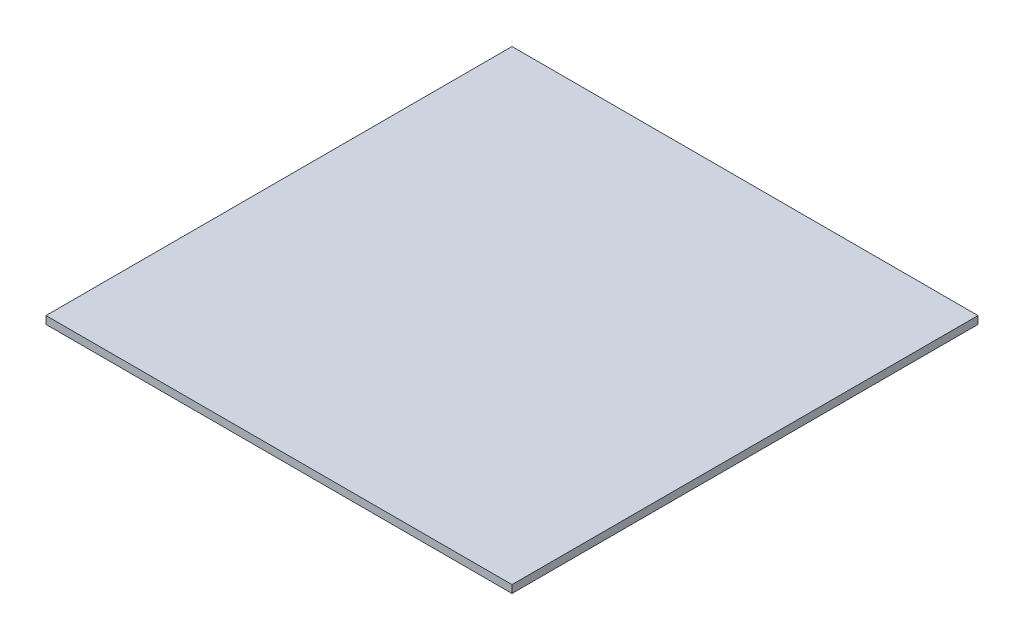
ISO-10303-21;
HEADER;
FILE_DESCRIPTION(('STEP AP214'),'2;1');
FILE_NAME('part.step','',(''),(''),'','','');
FILE_SCHEMA(('AUTOMOTIVE_DESIGN { 1 0 10303 214 1 1 1 1 }'));
ENDSEC;
DATA;
#1=APPLICATION_CONTEXT('core data for automotive mechanical design processes');
#2=APPLICATION_PROTOCOL_DEFINITION('international standard','automotive_design',2000,#1);
#3=PRODUCT_CONTEXT('',#1,'mechanical');
#4=PRODUCT('Part','Part','',(#3));
#5=PRODUCT_RELATED_PRODUCT_CATEGORY('part','',(#4));
#6=PRODUCT_DEFINITION_FORMATION('','',#4);
#7=PRODUCT_DEFINITION_CONTEXT('part definition',#1,'design');
#8=PRODUCT_DEFINITION('design','',#6,#7);
#9=PRODUCT_DEFINITION_SHAPE('','',#8);
#10=(LENGTH_UNIT() NAMED_UNIT(*) SI_UNIT(.MILLI.,.METRE.));
#11=(NAMED_UNIT(*) PLANE_ANGLE_UNIT() SI_UNIT($,.RADIAN.));
#12=(NAMED_UNIT(*) SI_UNIT($,.STERADIAN.) SOLID_ANGLE_UNIT());
#13=UNCERTAINTY_MEASURE_WITH_UNIT(LENGTH_MEASURE(1.E-05),#10,'distance_accuracy_value','');
#14=(GEOMETRIC_REPRESENTATION_CONTEXT(3) GLOBAL_UNCERTAINTY_ASSIGNED_CONTEXT((#13)) GLOBAL_UNIT_ASSIGNED_CONTEXT((#10,
#11,#12)) REPRESENTATION_CONTEXT('',''));
#15=CARTESIAN_POINT('',(0.,0.,0.));
#16=DIRECTION('',(0.,0.,1.));
#17=DIRECTION('',(1.,0.,0.));
#18=AXIS2_PLACEMENT_3D('',#15,#16,#17);
#19=CARTESIAN_POINT('',(-2.8921130952381,3.175,-1.56584821428571));
#20=DIRECTION('',(1.,0.,0.));
#21=DIRECTION('',(0.,0.,-1.));
#22=AXIS2_PLACEMENT_3D('',#19,#20,#21);
#23=PLANE('',#22);
#24=DIRECTION('',(0.,0.,1.));
#25=VECTOR('',#24,1.);
#26=CARTESIAN_POINT('',(-2.8921130952381,0.,-1.56584821428571));
#27=LINE('',#26,#25);
#28=CARTESIAN_POINT('',(-2.8921130952381,0.,-1.56584821428571));
#29=VERTEX_POINT('',#28);
#30=CARTESIAN_POINT('',(-2.89211309523807,0.,190.204151785714));
#31=VERTEX_POINT('',#30);
#32=EDGE_CURVE('E113',#29,#31,#27,.T.);
#33=ORIENTED_EDGE('',*,*,#32,.T.);
#34=DIRECTION('',(0.,-1.,0.));
#35=VECTOR('',#34,1.);
#36=CARTESIAN_POINT('',(-2.89211309523807,3.175,190.204151785714));
#37=LINE('',#36,#35);
#38=CARTESIAN_POINT('',(-2.89211309523807,3.175,190.204151785714));
#39=VERTEX_POINT('',#38);
#40=EDGE_CURVE('E11',#39,#31,#37,.T.);
#41=ORIENTED_EDGE('',*,*,#40,.F.);
#42=DIRECTION('',(0.,0.,1.));
#43=VECTOR('',#42,1.);
#44=CARTESIAN_POINT('',(-2.8921130952381,3.175,-1.56584821428571));
#45=LINE('',#44,#43);
#46=CARTESIAN_POINT('',(-2.8921130952381,3.175,-1.56584821428571));
#47=VERTEX_POINT('',#46);
#48=EDGE_CURVE('E97',#47,#39,#45,.T.);
#49=ORIENTED_EDGE('',*,*,#48,.F.);
#50=DIRECTION('',(0.,-1.,0.));
#51=VECTOR('',#50,1.);
#52=CARTESIAN_POINT('',(-2.8921130952381,3.175,-1.56584821428571));
#53=LINE('',#52,#51);
#54=EDGE_CURVE('E109',#47,#29,#53,.T.);
#55=ORIENTED_EDGE('',*,*,#54,.T.);
#56=EDGE_LOOP('',(#33,#41,#49,#55));
#57=FACE_BOUND('',#56,.T.);
#58=ADVANCED_FACE('F45',(#57),#23,.F.);
#59=CARTESIAN_POINT('',(-2.89211309523807,3.175,190.204151785714));
#60=DIRECTION('',(0.,0.,-1.));
#61=DIRECTION('',(-1.,0.,0.));
#62=AXIS2_PLACEMENT_3D('',#59,#60,#61);
#63=PLANE('',#62);
#64=DIRECTION('',(1.,0.,0.));
#65=VECTOR('',#64,1.);
#66=CARTESIAN_POINT('',(-2.89211309523807,0.,190.204151785714));
#67=LINE('',#66,#65);
#68=CARTESIAN_POINT('',(188.877886904762,0.,190.204151785714));
#69=VERTEX_POINT('',#68);
#70=EDGE_CURVE('E102',#31,#69,#67,.T.);
#71=ORIENTED_EDGE('',*,*,#70,.T.);
#72=DIRECTION('',(0.,-1.,0.));
#73=VECTOR('',#72,1.);
#74=CARTESIAN_POINT('',(188.877886904762,3.175,190.204151785714));
#75=LINE('',#74,#73);
#76=CARTESIAN_POINT('',(188.877886904762,3.175,190.204151785714));
#77=VERTEX_POINT('',#76);
#78=EDGE_CURVE('E54',#77,#69,#75,.T.);
#79=ORIENTED_EDGE('',*,*,#78,.F.);
#80=DIRECTION('',(1.,0.,0.));
#81=VECTOR('',#80,1.);
#82=CARTESIAN_POINT('',(-2.89211309523807,3.175,190.204151785714));
#83=LINE('',#82,#81);
#84=EDGE_CURVE('E92',#39,#77,#83,.T.);
#85=ORIENTED_EDGE('',*,*,#84,.F.);
#86=ORIENTED_EDGE('',*,*,#40,.T.);
#87=EDGE_LOOP('',(#71,#79,#85,#86));
#88=FACE_BOUND('',#87,.T.);
#89=ADVANCED_FACE('F101',(#88),#63,.F.);
#90=CARTESIAN_POINT('',(188.877886904762,3.175,-1.56584821428571));
#91=DIRECTION('',(-1.,0.,0.));
#92=DIRECTION('',(0.,0.,1.));
#93=AXIS2_PLACEMENT_3D('',#90,#91,#92);
#94=PLANE('',#93);
#95=DIRECTION('',(0.,0.,-1.));
#96=VECTOR('',#95,1.);
#97=CARTESIAN_POINT('',(188.877886904762,0.,-1.56584821428571));
#98=LINE('',#97,#96);
#99=CARTESIAN_POINT('',(188.877886904762,0.,-1.56584821428571));
#100=VERTEX_POINT('',#99);
#101=EDGE_CURVE('E79',#69,#100,#98,.T.);
#102=ORIENTED_EDGE('',*,*,#101,.T.);
#103=DIRECTION('',(0.,-1.,0.));
#104=VECTOR('',#103,1.);
#105=CARTESIAN_POINT('',(188.877886904762,3.175,-1.56584821428571));
#106=LINE('',#105,#104);
#107=CARTESIAN_POINT('',(188.877886904762,3.175,-1.56584821428571));
#108=VERTEX_POINT('',#107);
#109=EDGE_CURVE('E104',#108,#100,#106,.T.);
#110=ORIENTED_EDGE('',*,*,#109,.F.);
#111=DIRECTION('',(0.,0.,-1.));
#112=VECTOR('',#111,1.);
#113=CARTESIAN_POINT('',(188.877886904762,3.175,-1.56584821428571));
#114=LINE('',#113,#112);
#115=EDGE_CURVE('E95',#77,#108,#114,.T.);
#116=ORIENTED_EDGE('',*,*,#115,.F.);
#117=ORIENTED_EDGE('',*,*,#78,.T.);
#118=EDGE_LOOP('',(#102,#110,#116,#117));
#119=FACE_BOUND('',#118,.T.);
#120=ADVANCED_FACE('F105',(#119),#94,.F.);
#121=CARTESIAN_POINT('',(-2.8921130952381,3.175,-1.56584821428571));
#122=DIRECTION('',(0.,0.,1.));
#123=DIRECTION('',(1.,0.,0.));
#124=AXIS2_PLACEMENT_3D('',#121,#122,#123);
#125=PLANE('',#124);
#126=DIRECTION('',(-1.,0.,0.));
#127=VECTOR('',#126,1.);
#128=CARTESIAN_POINT('',(-2.8921130952381,0.,-1.56584821428571));
#129=LINE('',#128,#127);
#130=EDGE_CURVE('E85',#100,#29,#129,.T.);
#131=ORIENTED_EDGE('',*,*,#130,.T.);
#132=ORIENTED_EDGE('',*,*,#54,.F.);
#133=DIRECTION('',(-1.,0.,0.));
#134=VECTOR('',#133,1.);
#135=CARTESIAN_POINT('',(-2.8921130952381,3.175,-1.56584821428571));
#136=LINE('',#135,#134);
#137=EDGE_CURVE('E62',#108,#47,#136,.T.);
#138=ORIENTED_EDGE('',*,*,#137,.F.);
#139=ORIENTED_EDGE('',*,*,#109,.T.);
#140=EDGE_LOOP('',(#131,#132,#138,#139));
#141=FACE_BOUND('',#140,.T.);
#142=ADVANCED_FACE('F126',(#141),#125,.F.);
#143=CARTESIAN_POINT('',(0.,3.175,0.));
#144=DIRECTION('',(0.,1.,0.));
#145=DIRECTION('',(0.,0.,1.));
#146=AXIS2_PLACEMENT_3D('',#143,#144,#145);
#147=PLANE('',#146);
#148=ORIENTED_EDGE('',*,*,#48,.T.);
#149=ORIENTED_EDGE('',*,*,#84,.T.);
#150=ORIENTED_EDGE('',*,*,#115,.T.);
#151=ORIENTED_EDGE('',*,*,#137,.T.);
#152=EDGE_LOOP('',(#148,#149,#150,#151));
#153=FACE_BOUND('',#152,.T.);
#154=ADVANCED_FACE('F93',(#153),#147,.T.);
#155=CARTESIAN_POINT('',(0.,0.,0.));
#156=DIRECTION('',(0.,1.,0.));
#157=DIRECTION('',(0.,0.,1.));
#158=AXIS2_PLACEMENT_3D('',#155,#156,#157);
#159=PLANE('',#158);
#160=ORIENTED_EDGE('',*,*,#32,.F.);
#161=ORIENTED_EDGE('',*,*,#130,.F.);
#162=ORIENTED_EDGE('',*,*,#101,.F.);
#163=ORIENTED_EDGE('',*,*,#70,.F.);
#164=EDGE_LOOP('',(#160,#161,#162,#163));
#165=FACE_BOUND('',#164,.T.);
#166=ADVANCED_FACE('F129',(#165),#159,.F.);
#167=CLOSED_SHELL('',(#58,#89,#120,#142,#154,#166));
#168=MANIFOLD_SOLID_BREP('B2',#167);
#169=ADVANCED_BREP_SHAPE_REPRESENTATION('',(#18,#168),#14);
#170=SHAPE_DEFINITION_REPRESENTATION(#9,#169);
ENDSEC;
END-ISO-10303-21;
